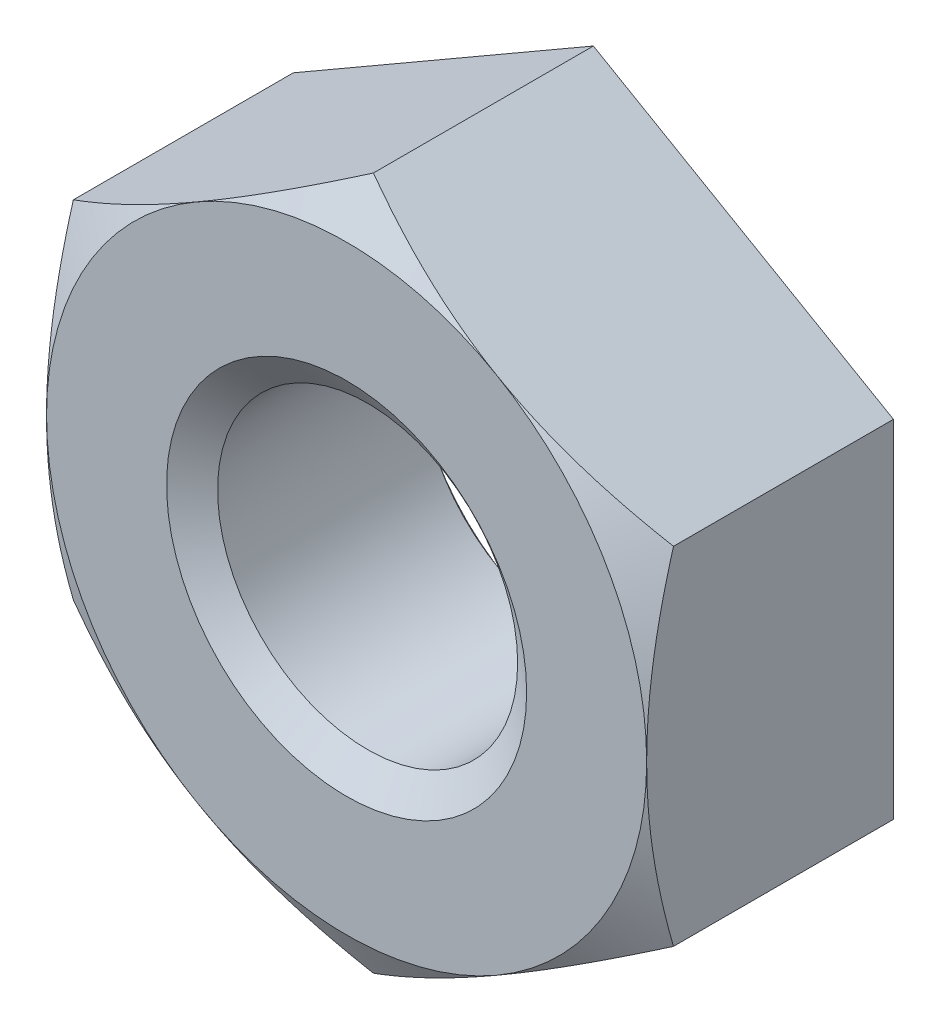
ISO-10303-21;
HEADER;
FILE_DESCRIPTION(('STEP AP214'),'2;1');
FILE_NAME('part.step','',(''),(''),'','','');
FILE_SCHEMA(('AUTOMOTIVE_DESIGN { 1 0 10303 214 1 1 1 1 }'));
ENDSEC;
DATA;
#1=APPLICATION_CONTEXT('core data for automotive mechanical design processes');
#2=APPLICATION_PROTOCOL_DEFINITION('international standard','automotive_design',2000,#1);
#3=PRODUCT_CONTEXT('',#1,'mechanical');
#4=PRODUCT('Part','Part','',(#3));
#5=PRODUCT_RELATED_PRODUCT_CATEGORY('part','',(#4));
#6=PRODUCT_DEFINITION_FORMATION('','',#4);
#7=PRODUCT_DEFINITION_CONTEXT('part definition',#1,'design');
#8=PRODUCT_DEFINITION('design','',#6,#7);
#9=PRODUCT_DEFINITION_SHAPE('','',#8);
#10=(LENGTH_UNIT() NAMED_UNIT(*) SI_UNIT(.MILLI.,.METRE.));
#11=(NAMED_UNIT(*) PLANE_ANGLE_UNIT() SI_UNIT($,.RADIAN.));
#12=(NAMED_UNIT(*) SI_UNIT($,.STERADIAN.) SOLID_ANGLE_UNIT());
#13=UNCERTAINTY_MEASURE_WITH_UNIT(LENGTH_MEASURE(1.E-05),#10,'distance_accuracy_value','');
#14=(GEOMETRIC_REPRESENTATION_CONTEXT(3) GLOBAL_UNCERTAINTY_ASSIGNED_CONTEXT((#13)) GLOBAL_UNIT_ASSIGNED_CONTEXT((#10,
#11,#12)) REPRESENTATION_CONTEXT('',''));
#15=CARTESIAN_POINT('',(0.,0.,0.));
#16=DIRECTION('',(0.,0.,1.));
#17=DIRECTION('',(1.,0.,0.));
#18=AXIS2_PLACEMENT_3D('',#15,#16,#17);
#19=CARTESIAN_POINT('',(0.,0.,-6.5278));
#20=DIRECTION('',(0.,0.,1.));
#21=DIRECTION('',(1.,0.,0.));
#22=AXIS2_PLACEMENT_3D('',#19,#20,#21);
#23=CYLINDRICAL_SURFACE('',#22,3.96875);
#24=CARTESIAN_POINT('',(0.,0.,-0.555789733453956));
#25=DIRECTION('',(0.,0.,1.));
#26=DIRECTION('',(1.,0.,0.));
#27=AXIS2_PLACEMENT_3D('',#24,#25,#26);
#28=CIRCLE('',#27,3.96875);
#29=CARTESIAN_POINT('',(3.96875,0.,-0.555789733453956));
#30=VERTEX_POINT('',#29);
#31=EDGE_CURVE('E131',#30,#30,#28,.F.);
#32=CARTESIAN_POINT('',(0.,0.,-5.94661026654604));
#33=DIRECTION('',(0.,0.,-1.));
#34=DIRECTION('',(-1.,0.,0.));
#35=AXIS2_PLACEMENT_3D('',#32,#33,#34);
#36=CIRCLE('',#35,3.96875);
#37=CARTESIAN_POINT('',(3.96875,0.,-5.94661026654604));
#38=VERTEX_POINT('',#37);
#39=EDGE_CURVE('E37',#38,#38,#36,.F.);
#40=CARTESIAN_POINT('',(3.96875,0.,-0.555789733453956));
#41=CARTESIAN_POINT('',(3.96875,0.,-0.611944114006998));
#42=CARTESIAN_POINT('',(3.96875,0.,-0.668098494560041));
#43=CARTESIAN_POINT('',(3.96875,0.,-0.780407255666126));
#44=CARTESIAN_POINT('',(3.96875,0.,-0.836561636219169));
#45=CARTESIAN_POINT('',(3.96875,0.,-0.948870397325254));
#46=CARTESIAN_POINT('',(3.96875,0.,-1.0050247778783));
#47=CARTESIAN_POINT('',(3.96875,0.,-1.11733353898438));
#48=CARTESIAN_POINT('',(3.96875,0.,-1.17348791953742));
#49=CARTESIAN_POINT('',(3.96875,0.,-1.28579668064351));
#50=CARTESIAN_POINT('',(3.96875,0.,-1.34195106119655));
#51=CARTESIAN_POINT('',(3.96875,0.,-1.45425982230264));
#52=CARTESIAN_POINT('',(3.96875,0.,-1.51041420285568));
#53=CARTESIAN_POINT('',(3.96875,0.,-1.62272296396176));
#54=CARTESIAN_POINT('',(3.96875,0.,-1.67887734451481));
#55=CARTESIAN_POINT('',(3.96875,0.,-1.79118610562089));
#56=CARTESIAN_POINT('',(3.96875,0.,-1.84734048617393));
#57=CARTESIAN_POINT('',(3.96875,0.,-1.95964924728002));
#58=CARTESIAN_POINT('',(3.96875,0.,-2.01580362783306));
#59=CARTESIAN_POINT('',(3.96875,0.,-2.12811238893915));
#60=CARTESIAN_POINT('',(3.96875,0.,-2.18426676949219));
#61=CARTESIAN_POINT('',(3.96875,0.,-2.29657553059828));
#62=CARTESIAN_POINT('',(3.96875,0.,-2.35272991115132));
#63=CARTESIAN_POINT('',(3.96875,0.,-2.4650386722574));
#64=CARTESIAN_POINT('',(3.96875,0.,-2.52119305281045));
#65=CARTESIAN_POINT('',(3.96875,0.,-2.63350181391653));
#66=CARTESIAN_POINT('',(3.96875,0.,-2.68965619446957));
#67=CARTESIAN_POINT('',(3.96875,0.,-2.80196495557566));
#68=CARTESIAN_POINT('',(3.96875,0.,-2.8581193361287));
#69=CARTESIAN_POINT('',(3.96875,0.,-2.97042809723479));
#70=CARTESIAN_POINT('',(3.96875,0.,-3.02658247778783));
#71=CARTESIAN_POINT('',(3.96875,0.,-3.13889123889391));
#72=CARTESIAN_POINT('',(3.96875,0.,-3.19504561944696));
#73=CARTESIAN_POINT('',(3.96875,0.,-3.30735438055304));
#74=CARTESIAN_POINT('',(3.96875,0.,-3.36350876110608));
#75=CARTESIAN_POINT('',(3.96875,0.,-3.47581752221217));
#76=CARTESIAN_POINT('',(3.96875,0.,-3.53197190276521));
#77=CARTESIAN_POINT('',(3.96875,0.,-3.6442806638713));
#78=CARTESIAN_POINT('',(3.96875,0.,-3.70043504442434));
#79=CARTESIAN_POINT('',(3.96875,0.,-3.81274380553042));
#80=CARTESIAN_POINT('',(3.96875,0.,-3.86889818608347));
#81=CARTESIAN_POINT('',(3.96875,0.,-3.98120694718955));
#82=CARTESIAN_POINT('',(3.96875,0.,-4.03736132774259));
#83=CARTESIAN_POINT('',(3.96875,0.,-4.14967008884868));
#84=CARTESIAN_POINT('',(3.96875,0.,-4.20582446940172));
#85=CARTESIAN_POINT('',(3.96875,0.,-4.31813323050781));
#86=CARTESIAN_POINT('',(3.96875,0.,-4.37428761106085));
#87=CARTESIAN_POINT('',(3.96875,0.,-4.48659637216693));
#88=CARTESIAN_POINT('',(3.96875,0.,-4.54275075271998));
#89=CARTESIAN_POINT('',(3.96875,0.,-4.65505951382606));
#90=CARTESIAN_POINT('',(3.96875,0.,-4.7112138943791));
#91=CARTESIAN_POINT('',(3.96875,0.,-4.82352265548519));
#92=CARTESIAN_POINT('',(3.96875,0.,-4.87967703603823));
#93=CARTESIAN_POINT('',(3.96875,0.,-4.99198579714432));
#94=CARTESIAN_POINT('',(3.96875,0.,-5.04814017769736));
#95=CARTESIAN_POINT('',(3.96875,0.,-5.16044893880344));
#96=CARTESIAN_POINT('',(3.96875,0.,-5.21660331935649));
#97=CARTESIAN_POINT('',(3.96875,0.,-5.32891208046257));
#98=CARTESIAN_POINT('',(3.96875,0.,-5.38506646101562));
#99=CARTESIAN_POINT('',(3.96875,0.,-5.4973752221217));
#100=CARTESIAN_POINT('',(3.96875,0.,-5.55352960267474));
#101=CARTESIAN_POINT('',(3.96875,0.,-5.66583836378083));
#102=CARTESIAN_POINT('',(3.96875,0.,-5.72199274433387));
#103=CARTESIAN_POINT('',(3.96875,0.,-5.83430150543996));
#104=CARTESIAN_POINT('',(3.96875,0.,-5.890455885993));
#105=CARTESIAN_POINT('',(3.96875,0.,-5.94661026654604));
#106=B_SPLINE_CURVE_WITH_KNOTS('',3,(#40,#41,#42,#43,#44,#45,#46,#47,#48,#49,#50,#51,#52,#53,
#54,#55,#56,#57,#58,#59,#60,#61,#62,#63,#64,#65,#66,#67,#68,#69,#70,#71,#72,#73,#74,#75,#76,#77,
#78,#79,#80,#81,#82,#83,#84,#85,#86,#87,#88,#89,#90,#91,#92,#93,#94,#95,#96,#97,#98,#99,#100,
#101,#102,#103,#104,#105),.UNSPECIFIED.,.F.,.F.,(4,2,2,2,2,2,2,2,2,2,2,2,2,2,2,2,2,2,2,2,2,2,2,
2,2,2,2,2,2,2,2,2,4),(0.,0.168463141659128,0.336926283318256,0.505389424977383,
0.673852566636511,0.842315708295639,1.01077884995477,1.17924199161389,1.34770513327302,
1.51616827493215,1.68463141659128,1.8530945582504,2.02155769990953,2.19002084156866,
2.35848398322779,2.52694712488691,2.69541026654604,2.86387340820517,3.0323365498643,
3.20079969152343,3.36926283318255,3.53772597484168,3.70618911650081,3.87465225815994,
4.04311539981906,4.21157854147819,4.38004168313732,4.54850482479645,4.71696796645557,
4.8854311081147,5.05389424977383,5.22235739143296,5.39082053309209),.UNSPECIFIED.);
#107=EDGE_CURVE('BSEAM32',#30,#38,#106,.T.);
#108=ORIENTED_EDGE('',*,*,#31,.F.);
#109=ORIENTED_EDGE('',*,*,#39,.F.);
#110=ORIENTED_EDGE('',*,*,#107,.T.);
#111=ORIENTED_EDGE('',*,*,#107,.F.);
#112=EDGE_LOOP('',(#108,#110,#109,#111));
#113=FACE_BOUND('',#112,.T.);
#114=ADVANCED_FACE('F32',(#113),#23,.F.);
#115=CARTESIAN_POINT('',(0.,9.16543552338532,-6.5278));
#116=DIRECTION('',(-0.499999999999983,0.866025403784448,0.));
#117=DIRECTION('',(-0.866025403784448,-0.499999999999983,0.));
#118=AXIS2_PLACEMENT_3D('',#115,#116,#117);
#119=PLANE('',#118);
#120=DIRECTION('',(0.,0.,1.));
#121=VECTOR('',#120,1.);
#122=CARTESIAN_POINT('',(-7.9375,4.58271776169282,-6.5278));
#123=LINE('',#122,#121);
#124=CARTESIAN_POINT('',(-7.9375,4.58271776169282,-6.5278));
#125=VERTEX_POINT('',#124);
#126=CARTESIAN_POINT('',(-7.9375,4.58271776169282,-0.708948904974025));
#127=VERTEX_POINT('',#126);
#128=EDGE_CURVE('E228',#125,#127,#123,.T.);
#129=ORIENTED_EDGE('',*,*,#128,.T.);
#130=CARTESIAN_POINT('',(-7.9377,4.58260229163898,-0.709015572900557));
#131=CARTESIAN_POINT('',(-7.76322502158793,4.68333546739203,-0.650866285897806));
#132=CARTESIAN_POINT('',(-7.58809953864738,4.78444421210972,-0.595356039210498));
#133=CARTESIAN_POINT('',(-7.23642632358312,4.98748283749384,-0.490340491808437));
#134=CARTESIAN_POINT('',(-7.05987801235101,5.08941305250867,-0.440837783112786));
#135=CARTESIAN_POINT('',(-6.52740632749454,5.39683572309639,-0.302312723142144));
#136=CARTESIAN_POINT('',(-6.16938105017105,5.60354171333579,-0.223521451359169));
#137=CARTESIAN_POINT('',(-5.63360314162946,5.91287323305812,-0.131129350120179));
#138=CARTESIAN_POINT('',(-5.45745113218669,6.01457464312819,-0.104809503727463));
#139=CARTESIAN_POINT('',(-5.10435050058562,6.21843738783409,-0.0606755611211758));
#140=CARTESIAN_POINT('',(-4.92740195020686,6.32059868102797,-0.0428607133854928));
#141=CARTESIAN_POINT('',(-4.57320017052289,6.52509717387595,-0.0161882579708191));
#142=CARTESIAN_POINT('',(-4.39594751669924,6.62743404127561,-0.00732048505628344));
#143=CARTESIAN_POINT('',(-4.04127846358514,6.83220231456425,0.00126770549344311));
#144=CARTESIAN_POINT('',(-3.86386206952283,6.93463371743477,0.000988405729545646));
#145=CARTESIAN_POINT('',(-3.53217533850321,7.12613314087557,-0.00808134398121513));
#146=CARTESIAN_POINT('',(-3.37788159577035,7.21521467477666,-0.0157654088390288));
#147=CARTESIAN_POINT('',(-3.06965548223459,7.39316910439779,-0.0379026215782627));
#148=CARTESIAN_POINT('',(-2.91572313649499,7.48204198564754,-0.0523562257657692));
#149=CARTESIAN_POINT('',(-2.45452203220573,7.74831656735948,-0.105529699236207));
#150=CARTESIAN_POINT('',(-2.14806963971136,7.92524693865991,-0.154055589218118));
#151=CARTESIAN_POINT('',(-1.5319140460875,8.28098453650132,-0.275371211073317));
#152=CARTESIAN_POINT('',(-1.22228948290784,8.4597463614008,-0.348675201689165));
#153=CARTESIAN_POINT('',(-0.607657694775784,8.81460418973134,-0.51504499141566));
#154=CARTESIAN_POINT('',(-0.302642598800529,8.99070473749954,-0.608071713945547));
#155=CARTESIAN_POINT('',(0.000200000000093927,9.16555099343916,-0.709015572900516));
#156=B_SPLINE_CURVE_WITH_KNOTS('',3,(#130,#131,#132,#133,#134,#135,#136,#137,#138,#139,#140,
#141,#142,#143,#144,#145,#146,#147,#148,#149,#150,#151,#152,#153,#154,#155),.UNSPECIFIED.,.F.,
.F.,(4,2,2,2,2,2,2,2,2,2,2,2,4),(0.,0.629020687135161,1.25831181455686,2.51950872534228,
3.13466137542382,3.74975965907415,4.36415830804195,4.97853797504025,5.5133907473673,
6.04827957705293,7.11881916910901,8.21310135188793,9.30523536686631),.UNSPECIFIED.);
#157=CARTESIAN_POINT('',(-3.96874999999987,6.87407664253906,0.));
#158=VERTEX_POINT('',#157);
#159=EDGE_CURVE('E117',#127,#158,#156,.T.);
#160=ORIENTED_EDGE('',*,*,#159,.T.);
#161=CARTESIAN_POINT('',(0.,9.16543552338532,-0.708948904974024));
#162=VERTEX_POINT('',#161);
#163=EDGE_CURVE('E143',#158,#162,#156,.T.);
#164=ORIENTED_EDGE('',*,*,#163,.T.);
#165=DIRECTION('',(0.,0.,1.));
#166=VECTOR('',#165,1.);
#167=CARTESIAN_POINT('',(0.,9.16543552338532,-6.5278));
#168=LINE('',#167,#166);
#169=CARTESIAN_POINT('',(0.,9.16543552338532,-6.5278));
#170=VERTEX_POINT('',#169);
#171=EDGE_CURVE('E240',#170,#162,#168,.T.);
#172=ORIENTED_EDGE('',*,*,#171,.F.);
#173=DIRECTION('',(-0.866025403784448,-0.499999999999983,0.));
#174=VECTOR('',#173,1.);
#175=CARTESIAN_POINT('',(0.,9.16543552338532,-6.5278));
#176=LINE('',#175,#174);
#177=EDGE_CURVE('E256',#170,#125,#176,.T.);
#178=ORIENTED_EDGE('',*,*,#177,.T.);
#179=EDGE_LOOP('',(#129,#160,#164,#172,#178));
#180=FACE_BOUND('',#179,.T.);
#181=ADVANCED_FACE('F34',(#180),#119,.T.);
#182=CARTESIAN_POINT('',(7.9375,4.58271776169249,-6.5278));
#183=DIRECTION('',(0.500000000000019,0.866025403784428,0.));
#184=DIRECTION('',(-0.866025403784428,0.500000000000019,0.));
#185=AXIS2_PLACEMENT_3D('',#182,#183,#184);
#186=PLANE('',#185);
#187=ORIENTED_EDGE('',*,*,#171,.T.);
#188=CARTESIAN_POINT('',(-0.000199999999906354,9.16555099343916,-0.709015572900516));
#189=CARTESIAN_POINT('',(0.174274978412156,9.06481781768609,-0.650866285897766));
#190=CARTESIAN_POINT('',(0.349400461352702,8.9637090729684,-0.595356039210459));
#191=CARTESIAN_POINT('',(0.701073676416951,8.76067044758427,-0.490340491808397));
#192=CARTESIAN_POINT('',(0.877621987649049,8.65874023256944,-0.440837783112746));
#193=CARTESIAN_POINT('',(1.41009367250551,8.35131756198169,-0.302312723142102));
#194=CARTESIAN_POINT('',(1.76811894982899,8.14461157174228,-0.223521451359127));
#195=CARTESIAN_POINT('',(2.30389685837056,7.83528005201993,-0.131129350120134));
#196=CARTESIAN_POINT('',(2.48004886781333,7.73357864194985,-0.104809503727416));
#197=CARTESIAN_POINT('',(2.83314949941439,7.52971589724394,-0.0606755611211275));
#198=CARTESIAN_POINT('',(3.01009804979314,7.42755460405005,-0.0428607133854442));
#199=CARTESIAN_POINT('',(3.3642998294771,7.22305611120206,-0.0161882579707695));
#200=CARTESIAN_POINT('',(3.54155248330074,7.1207192438024,-0.00732048505623324));
#201=CARTESIAN_POINT('',(3.89622153641483,6.91595097051374,0.00126770549349557));
#202=CARTESIAN_POINT('',(4.07363793047713,6.81351956764322,0.000988405729599707));
#203=CARTESIAN_POINT('',(4.40532466149675,6.6220201442024,-0.00808134398115898));
#204=CARTESIAN_POINT('',(4.55961840422961,6.53293861030131,-0.0157654088389722));
#205=CARTESIAN_POINT('',(4.86784451776536,6.35498418068016,-0.0379026215782056));
#206=CARTESIAN_POINT('',(5.02177686350495,6.26611129943041,-0.0523562257657121));
#207=CARTESIAN_POINT('',(5.48297796779421,5.99983671771844,-0.105529699236149));
#208=CARTESIAN_POINT('',(5.78943036028858,5.822906346418,-0.154055589218058));
#209=CARTESIAN_POINT('',(6.40558595391242,5.46716874857657,-0.275371211073258));
#210=CARTESIAN_POINT('',(6.71521051709208,5.28840692367706,-0.348675201689106));
#211=CARTESIAN_POINT('',(7.32984230522413,4.9335490953465,-0.515044991415604));
#212=CARTESIAN_POINT('',(7.63485740119938,4.75744854757828,-0.608071713945493));
#213=CARTESIAN_POINT('',(7.9377,4.58260229163865,-0.709015572900463));
#214=B_SPLINE_CURVE_WITH_KNOTS('',3,(#188,#189,#190,#191,#192,#193,#194,#195,#196,#197,#198,
#199,#200,#201,#202,#203,#204,#205,#206,#207,#208,#209,#210,#211,#212,#213),.UNSPECIFIED.,.F.,
.F.,(4,2,2,2,2,2,2,2,2,2,2,2,4),(0.,0.629020687135155,1.25831181455685,2.51950872534226,
3.1346613754238,3.74975965907412,4.36415830804191,4.97853797504022,5.51339074736726,
6.0482795770529,7.11881916910899,8.21310135188792,9.30523536686631),.UNSPECIFIED.);
#215=CARTESIAN_POINT('',(3.96875000000015,6.8740766425389,0.));
#216=VERTEX_POINT('',#215);
#217=EDGE_CURVE('E139',#162,#216,#214,.T.);
#218=ORIENTED_EDGE('',*,*,#217,.T.);
#219=CARTESIAN_POINT('',(7.9375,4.58271776169268,-0.708948904974024));
#220=VERTEX_POINT('',#219);
#221=EDGE_CURVE('E126',#216,#220,#214,.T.);
#222=ORIENTED_EDGE('',*,*,#221,.T.);
#223=DIRECTION('',(0.,0.,1.));
#224=VECTOR('',#223,1.);
#225=CARTESIAN_POINT('',(7.9375,4.58271776169249,-6.5278));
#226=LINE('',#225,#224);
#227=CARTESIAN_POINT('',(7.9375,4.58271776169249,-6.5278));
#228=VERTEX_POINT('',#227);
#229=EDGE_CURVE('E138',#228,#220,#226,.T.);
#230=ORIENTED_EDGE('',*,*,#229,.F.);
#231=DIRECTION('',(-0.866025403784428,0.500000000000019,0.));
#232=VECTOR('',#231,1.);
#233=CARTESIAN_POINT('',(7.9375,4.58271776169249,-6.5278));
#234=LINE('',#233,#232);
#235=EDGE_CURVE('E232',#228,#170,#234,.T.);
#236=ORIENTED_EDGE('',*,*,#235,.T.);
#237=EDGE_LOOP('',(#187,#218,#222,#230,#236));
#238=FACE_BOUND('',#237,.T.);
#239=ADVANCED_FACE('F208',(#238),#186,.T.);
#240=CARTESIAN_POINT('',(7.9375,4.58271776169249,-6.5278));
#241=DIRECTION('',(-1.,0.,0.));
#242=DIRECTION('',(0.,0.,1.));
#243=AXIS2_PLACEMENT_3D('',#240,#241,#242);
#244=PLANE('',#243);
#245=CARTESIAN_POINT('',(7.9375,-12.1540428550748,-3.79830572339944));
#246=CARTESIAN_POINT('',(7.9375,-11.8055417137513,-3.62989072544695));
#247=CARTESIAN_POINT('',(7.9375,-11.4562166090856,-3.46314991100229));
#248=CARTESIAN_POINT('',(7.9375,-10.7554729351183,-3.13397333785365));
#249=CARTESIAN_POINT('',(7.9375,-10.4040540160887,-2.97153832452219));
#250=CARTESIAN_POINT('',(7.9375,-9.69677883875674,-2.65107432577963));
#251=CARTESIAN_POINT('',(7.9375,-9.34090869565809,-2.49307587372601));
#252=CARTESIAN_POINT('',(7.9375,-8.62624353744284,-2.18386537817083));
#253=CARTESIAN_POINT('',(7.9375,-8.26744867594113,-2.03265298092497));
#254=CARTESIAN_POINT('',(7.9375,-7.54190895000615,-1.73702395542256));
#255=CARTESIAN_POINT('',(7.9375,-7.17512056255616,-1.59271354918174));
#256=CARTESIAN_POINT('',(7.9375,-6.43721845801451,-1.31539498874067));
#257=CARTESIAN_POINT('',(7.9375,-6.066104264908,-1.18238809199672));
#258=CARTESIAN_POINT('',(7.9375,-5.31971777432218,-0.931250932769844));
#259=CARTESIAN_POINT('',(7.9375,-4.94445623605253,-0.813089042609656));
#260=CARTESIAN_POINT('',(7.9375,-4.18861180807505,-0.595477465323818));
#261=CARTESIAN_POINT('',(7.9375,-3.80803064222036,-0.496021860734109));
#262=CARTESIAN_POINT('',(7.9375,-3.0412234172515,-0.320658395772123));
#263=CARTESIAN_POINT('',(7.9375,-2.65499588371972,-0.244756805288625));
#264=CARTESIAN_POINT('',(7.9375,-2.07225592781309,-0.152370391651536));
#265=CARTESIAN_POINT('',(7.9375,-1.87741892555742,-0.125150577555812));
#266=CARTESIAN_POINT('',(7.9375,-1.48683143967858,-0.0784018471326018));
#267=CARTESIAN_POINT('',(7.9375,-1.29108104843307,-0.0588721694033842));
#268=CARTESIAN_POINT('',(7.9375,-0.900173147631192,-0.0280292816344308));
#269=CARTESIAN_POINT('',(7.9375,-0.705019680022336,-0.0166650499450555));
#270=CARTESIAN_POINT('',(7.9375,-0.314406625859884,-0.00221313706756388));
#271=CARTESIAN_POINT('',(7.9375,-0.118947043314611,0.000874651601976446));
#272=CARTESIAN_POINT('',(7.9375,0.271871450970486,-0.00129989647433457));
#273=CARTESIAN_POINT('',(7.9375,0.467230375568073,-0.00655988978079131));
#274=CARTESIAN_POINT('',(7.9375,0.857556246985908,-0.0252991998003059));
#275=CARTESIAN_POINT('',(7.9375,1.05252317374343,-0.0387789269758079));
#276=CARTESIAN_POINT('',(7.9375,1.52506297457954,-0.0811297065316129));
#277=CARTESIAN_POINT('',(7.9375,1.80227278881696,-0.114119139529962));
#278=CARTESIAN_POINT('',(7.9375,2.35456818411291,-0.194883786983908));
#279=CARTESIAN_POINT('',(7.9375,2.62965316433381,-0.242663037198066));
#280=CARTESIAN_POINT('',(7.9375,3.17747194953975,-0.351312741869483));
#281=CARTESIAN_POINT('',(7.9375,3.4502032761159,-0.412195574142739));
#282=CARTESIAN_POINT('',(7.9375,3.99285991142013,-0.545194835610296));
#283=CARTESIAN_POINT('',(7.9375,4.26278548193587,-0.617310206545773));
#284=CARTESIAN_POINT('',(7.9375,4.80647881225565,-0.772934354165224));
#285=CARTESIAN_POINT('',(7.9375,5.08017856871108,-0.856679077611889));
#286=CARTESIAN_POINT('',(7.9375,5.62468506827777,-1.03244298730137));
#287=CARTESIAN_POINT('',(7.9375,5.89549366465436,-1.12445646631555));
#288=CARTESIAN_POINT('',(7.9375,6.43313118794731,-1.31485725841808));
#289=CARTESIAN_POINT('',(7.9375,6.69997393537356,-1.4132057801201));
#290=CARTESIAN_POINT('',(7.9375,7.23158910056609,-1.61567532168825));
#291=CARTESIAN_POINT('',(7.9375,7.49636063153354,-1.71979867460119));
#292=CARTESIAN_POINT('',(7.9375,7.76017027676663,-1.82623818485622));
#293=B_SPLINE_CURVE_WITH_KNOTS('',3,(#245,#246,#247,#248,#249,#250,#251,#252,#253,#254,#255,
#256,#257,#258,#259,#260,#261,#262,#263,#264,#265,#266,#267,#268,#269,#270,#271,#272,#273,#274,
#275,#276,#277,#278,#279,#280,#281,#282,#283,#284,#285,#286,#287,#288,#289,#290,#291,#292),
.UNSPECIFIED.,.F.,.F.,(4,2,2,2,2,2,2,2,2,2,2,2,2,2,2,2,2,2,2,2,2,2,2,4),(0.,1.16120027580623,
2.3226002700954,3.4906464875063,4.65863174596448,5.84095623854381,7.02341208683705,
8.20330434634276,9.38282273386193,10.5626548308775,11.1527144520002,11.7427156365191,
12.3289973680831,12.9152714859051,13.501381050453,14.0875198854945,14.9245510617841,
15.7618108438773,16.5998650111811,17.4378402700213,18.2963561134772,19.1542838811018,
20.007382654881,20.8608286295793),.UNSPECIFIED.);
#294=CARTESIAN_POINT('',(7.93749999999988,-4.58271776169289,-0.708948904974024));
#295=VERTEX_POINT('',#294);
#296=CARTESIAN_POINT('',(7.9375,0.,0.));
#297=VERTEX_POINT('',#296);
#298=EDGE_CURVE('E106',#295,#297,#293,.T.);
#299=ORIENTED_EDGE('',*,*,#298,.F.);
#300=DIRECTION('',(0.,0.,1.));
#301=VECTOR('',#300,1.);
#302=CARTESIAN_POINT('',(7.9375,-4.58271776169282,-6.5278));
#303=LINE('',#302,#301);
#304=CARTESIAN_POINT('',(7.9375,-4.58271776169282,-6.5278));
#305=VERTEX_POINT('',#304);
#306=EDGE_CURVE('E237',#305,#295,#303,.T.);
#307=ORIENTED_EDGE('',*,*,#306,.F.);
#308=DIRECTION('',(0.,-1.,0.));
#309=VECTOR('',#308,1.);
#310=CARTESIAN_POINT('',(7.9375,4.58271776169249,-6.5278));
#311=LINE('',#310,#309);
#312=EDGE_CURVE('E245',#228,#305,#311,.T.);
#313=ORIENTED_EDGE('',*,*,#312,.F.);
#314=ORIENTED_EDGE('',*,*,#229,.T.);
#315=EDGE_CURVE('E119',#297,#220,#293,.T.);
#316=ORIENTED_EDGE('',*,*,#315,.F.);
#317=EDGE_LOOP('',(#299,#307,#313,#314,#316));
#318=FACE_BOUND('',#317,.T.);
#319=ADVANCED_FACE('F136',(#318),#244,.F.);
#320=CARTESIAN_POINT('',(0.,-9.1654355233853,-6.5278));
#321=DIRECTION('',(0.499999999999982,-0.866025403784449,0.));
#322=DIRECTION('',(0.866025403784449,0.499999999999982,0.));
#323=AXIS2_PLACEMENT_3D('',#320,#321,#322);
#324=PLANE('',#323);
#325=ORIENTED_EDGE('',*,*,#306,.T.);
#326=CARTESIAN_POINT('',(7.9377,-4.58260229163898,-0.709015572900558));
#327=CARTESIAN_POINT('',(7.76322502158793,-4.68333546739203,-0.650866285897806));
#328=CARTESIAN_POINT('',(7.58809953864738,-4.78444421210972,-0.595356039210498));
#329=CARTESIAN_POINT('',(7.23642632358312,-4.98748283749384,-0.490340491808437));
#330=CARTESIAN_POINT('',(7.05987801235102,-5.08941305250867,-0.440837783112787));
#331=CARTESIAN_POINT('',(6.52740632749454,-5.39683572309639,-0.302312723142145));
#332=CARTESIAN_POINT('',(6.16938105017104,-5.60354171333579,-0.223521451359169));
#333=CARTESIAN_POINT('',(5.63360314162946,-5.91287323305811,-0.131129350120178));
#334=CARTESIAN_POINT('',(5.45745113218669,-6.01457464312819,-0.10480950372746));
#335=CARTESIAN_POINT('',(5.10435050058562,-6.21843738783408,-0.0606755611211728));
#336=CARTESIAN_POINT('',(4.92740195020686,-6.32059868102797,-0.0428607133854892));
#337=CARTESIAN_POINT('',(4.57320017052289,-6.52509717387594,-0.0161882579708156));
#338=CARTESIAN_POINT('',(4.39594751669924,-6.6274340412756,-0.00732048505628067));
#339=CARTESIAN_POINT('',(4.04127846358514,-6.83220231456424,0.00126770549344684));
#340=CARTESIAN_POINT('',(3.86386206952283,-6.93463371743476,0.000988405729551028));
#341=CARTESIAN_POINT('',(3.5321753385032,-7.12613314087556,-0.00808134398120855));
#342=CARTESIAN_POINT('',(3.37788159577034,-7.21521467477665,-0.0157654088390224));
#343=CARTESIAN_POINT('',(3.06965548223459,-7.39316910439778,-0.0379026215782568));
#344=CARTESIAN_POINT('',(2.91572313649499,-7.48204198564752,-0.0523562257657636));
#345=CARTESIAN_POINT('',(2.45452203220573,-7.74831656735947,-0.105529699236201));
#346=CARTESIAN_POINT('',(2.14806963971136,-7.92524693865989,-0.15405558921811));
#347=CARTESIAN_POINT('',(1.5319140460875,-8.2809845365013,-0.275371211073308));
#348=CARTESIAN_POINT('',(1.22228948290784,-8.45974636140079,-0.348675201689155));
#349=CARTESIAN_POINT('',(0.607657694775785,-8.81460418973132,-0.51504499141565));
#350=CARTESIAN_POINT('',(0.302642598800529,-8.99070473749952,-0.608071713945536));
#351=CARTESIAN_POINT('',(-0.000200000000094431,-9.16555099343914,-0.709015572900505));
#352=B_SPLINE_CURVE_WITH_KNOTS('',3,(#326,#327,#328,#329,#330,#331,#332,#333,#334,#335,#336,
#337,#338,#339,#340,#341,#342,#343,#344,#345,#346,#347,#348,#349,#350,#351),.UNSPECIFIED.,.F.,
.F.,(4,2,2,2,2,2,2,2,2,2,2,2,4),(0.,0.62902068713516,1.25831181455686,2.51950872534228,
3.13466137542383,3.74975965907415,4.36415830804195,4.97853797504025,5.51339074736729,
6.04827957705292,7.11881916910901,8.21310135188792,9.3052353668663),.UNSPECIFIED.);
#353=CARTESIAN_POINT('',(3.96874999999985,-6.87407664253907,0.));
#354=VERTEX_POINT('',#353);
#355=EDGE_CURVE('E112',#295,#354,#352,.T.);
#356=ORIENTED_EDGE('',*,*,#355,.T.);
#357=CARTESIAN_POINT('',(0.,-9.16543552338532,-0.708948904974024));
#358=VERTEX_POINT('',#357);
#359=EDGE_CURVE('E51',#354,#358,#352,.T.);
#360=ORIENTED_EDGE('',*,*,#359,.T.);
#361=DIRECTION('',(0.,0.,1.));
#362=VECTOR('',#361,1.);
#363=CARTESIAN_POINT('',(0.,-9.1654355233853,-6.5278));
#364=LINE('',#363,#362);
#365=CARTESIAN_POINT('',(0.,-9.1654355233853,-6.5278));
#366=VERTEX_POINT('',#365);
#367=EDGE_CURVE('E234',#366,#358,#364,.T.);
#368=ORIENTED_EDGE('',*,*,#367,.F.);
#369=DIRECTION('',(0.866025403784449,0.499999999999982,0.));
#370=VECTOR('',#369,1.);
#371=CARTESIAN_POINT('',(0.,-9.1654355233853,-6.5278));
#372=LINE('',#371,#370);
#373=EDGE_CURVE('E247',#366,#305,#372,.T.);
#374=ORIENTED_EDGE('',*,*,#373,.T.);
#375=EDGE_LOOP('',(#325,#356,#360,#368,#374));
#376=FACE_BOUND('',#375,.T.);
#377=ADVANCED_FACE('F190',(#376),#324,.T.);
#378=CARTESIAN_POINT('',(-7.9375,-4.58271776169249,-6.5278));
#379=DIRECTION('',(-0.500000000000017,-0.866025403784429,0.));
#380=DIRECTION('',(0.866025403784429,-0.500000000000017,0.));
#381=AXIS2_PLACEMENT_3D('',#378,#379,#380);
#382=PLANE('',#381);
#383=ORIENTED_EDGE('',*,*,#367,.T.);
#384=CARTESIAN_POINT('',(0.000199999999906325,-9.16555099343914,-0.709015572900505));
#385=CARTESIAN_POINT('',(-0.174274978412156,-9.06481781768607,-0.650866285897755));
#386=CARTESIAN_POINT('',(-0.349400461352702,-8.96370907296838,-0.595356039210447));
#387=CARTESIAN_POINT('',(-0.701073676416952,-8.76067044758425,-0.490340491808387));
#388=CARTESIAN_POINT('',(-0.87762198764905,-8.65874023256942,-0.440837783112736));
#389=CARTESIAN_POINT('',(-1.41009367250551,-8.35131756198168,-0.302312723142094));
#390=CARTESIAN_POINT('',(-1.76811894982899,-8.14461157174226,-0.223521451359119));
#391=CARTESIAN_POINT('',(-2.30389685837056,-7.83528005201992,-0.131129350120127));
#392=CARTESIAN_POINT('',(-2.48004886781333,-7.73357864194984,-0.10480950372741));
#393=CARTESIAN_POINT('',(-2.83314949941438,-7.52971589724393,-0.0606755611211221));
#394=CARTESIAN_POINT('',(-3.01009804979313,-7.42755460405004,-0.0428607133854383));
#395=CARTESIAN_POINT('',(-3.36429982947709,-7.22305611120205,-0.0161882579707634));
#396=CARTESIAN_POINT('',(-3.54155248330074,-7.12071924380239,-0.00732048505622729));
#397=CARTESIAN_POINT('',(-3.89622153641483,-6.91595097051374,0.00126770549350063));
#398=CARTESIAN_POINT('',(-4.07363793047713,-6.81351956764321,0.000988405729604086));
#399=CARTESIAN_POINT('',(-4.40532466149675,-6.6220201442024,-0.00808134398115554));
#400=CARTESIAN_POINT('',(-4.5596184042296,-6.5329386103013,-0.0157654088389691));
#401=CARTESIAN_POINT('',(-4.86784451776536,-6.35498418068015,-0.0379026215782025));
#402=CARTESIAN_POINT('',(-5.02177686350495,-6.26611129943041,-0.0523562257657086));
#403=CARTESIAN_POINT('',(-5.48297796779421,-5.99983671771844,-0.105529699236145));
#404=CARTESIAN_POINT('',(-5.78943036028858,-5.822906346418,-0.154055589218056));
#405=CARTESIAN_POINT('',(-6.40558595391242,-5.46716874857657,-0.275371211073257));
#406=CARTESIAN_POINT('',(-6.71521051709208,-5.28840692367706,-0.348675201689105));
#407=CARTESIAN_POINT('',(-7.32984230522413,-4.93354909534651,-0.515044991415604));
#408=CARTESIAN_POINT('',(-7.63485740119938,-4.75744854757829,-0.608071713945493));
#409=CARTESIAN_POINT('',(-7.9377,-4.58260229163866,-0.709015572900464));
#410=B_SPLINE_CURVE_WITH_KNOTS('',3,(#384,#385,#386,#387,#388,#389,#390,#391,#392,#393,#394,
#395,#396,#397,#398,#399,#400,#401,#402,#403,#404,#405,#406,#407,#408,#409),.UNSPECIFIED.,.F.,
.F.,(4,2,2,2,2,2,2,2,2,2,2,2,4),(0.,0.629020687135155,1.25831181455685,2.51950872534225,
3.1346613754238,3.74975965907412,4.36415830804191,4.97853797504021,5.51339074736725,
6.04827957705288,7.11881916910898,8.21310135188791,9.3052353668663),.UNSPECIFIED.);
#411=CARTESIAN_POINT('',(-3.96875000000013,-6.8740766425389,0.));
#412=VERTEX_POINT('',#411);
#413=EDGE_CURVE('E184',#358,#412,#410,.T.);
#414=ORIENTED_EDGE('',*,*,#413,.T.);
#415=CARTESIAN_POINT('',(-7.9375,-4.58271776169268,-0.708948904974024));
#416=VERTEX_POINT('',#415);
#417=EDGE_CURVE('E58',#412,#416,#410,.T.);
#418=ORIENTED_EDGE('',*,*,#417,.T.);
#419=DIRECTION('',(0.,0.,1.));
#420=VECTOR('',#419,1.);
#421=CARTESIAN_POINT('',(-7.9375,-4.58271776169249,-6.5278));
#422=LINE('',#421,#420);
#423=CARTESIAN_POINT('',(-7.9375,-4.58271776169249,-6.5278));
#424=VERTEX_POINT('',#423);
#425=EDGE_CURVE('E231',#424,#416,#422,.T.);
#426=ORIENTED_EDGE('',*,*,#425,.F.);
#427=DIRECTION('',(0.866025403784429,-0.500000000000017,0.));
#428=VECTOR('',#427,1.);
#429=CARTESIAN_POINT('',(-7.9375,-4.58271776169249,-6.5278));
#430=LINE('',#429,#428);
#431=EDGE_CURVE('E250',#424,#366,#430,.T.);
#432=ORIENTED_EDGE('',*,*,#431,.T.);
#433=EDGE_LOOP('',(#383,#414,#418,#426,#432));
#434=FACE_BOUND('',#433,.T.);
#435=ADVANCED_FACE('F186',(#434),#382,.T.);
#436=CARTESIAN_POINT('',(-7.9375,4.58271776169282,-6.5278));
#437=DIRECTION('',(-1.,0.,0.));
#438=DIRECTION('',(0.,-1.,0.));
#439=AXIS2_PLACEMENT_3D('',#436,#437,#438);
#440=PLANE('',#439);
#441=ORIENTED_EDGE('',*,*,#425,.T.);
#442=CARTESIAN_POINT('',(-7.93750000000001,-12.1540428550746,-3.79830572339936));
#443=CARTESIAN_POINT('',(-7.9375,-11.8055417137511,-3.62989072544688));
#444=CARTESIAN_POINT('',(-7.9375,-11.4562166090855,-3.46314991100222));
#445=CARTESIAN_POINT('',(-7.9375,-10.7554729351181,-3.13397333785358));
#446=CARTESIAN_POINT('',(-7.9375,-10.4040540160885,-2.97153832452213));
#447=CARTESIAN_POINT('',(-7.9375,-9.69677883875659,-2.65107432577956));
#448=CARTESIAN_POINT('',(-7.9375,-9.34090869565794,-2.49307587372594));
#449=CARTESIAN_POINT('',(-7.9375,-8.62624353744269,-2.18386537817077));
#450=CARTESIAN_POINT('',(-7.9375,-8.26744867594098,-2.03265298092491));
#451=CARTESIAN_POINT('',(-7.9375,-7.54190895000601,-1.7370239554225));
#452=CARTESIAN_POINT('',(-7.9375,-7.17512056255602,-1.59271354918169));
#453=CARTESIAN_POINT('',(-7.9375,-6.43721845801438,-1.31539498874063));
#454=CARTESIAN_POINT('',(-7.9375,-6.06610426490787,-1.18238809199668));
#455=CARTESIAN_POINT('',(-7.9375,-5.31971777432206,-0.931250932769806));
#456=CARTESIAN_POINT('',(-7.9375,-4.94445623605241,-0.813089042609621));
#457=CARTESIAN_POINT('',(-7.9375,-4.18861180807494,-0.595477465323789));
#458=CARTESIAN_POINT('',(-7.9375,-3.80803064222025,-0.496021860734083));
#459=CARTESIAN_POINT('',(-7.9375,-3.04122341725139,-0.320658395772102));
#460=CARTESIAN_POINT('',(-7.9375,-2.65499588371962,-0.244756805288607));
#461=CARTESIAN_POINT('',(-7.9375,-2.072255927813,-0.152370391651522));
#462=CARTESIAN_POINT('',(-7.9375,-1.87741892555732,-0.1251505775558));
#463=CARTESIAN_POINT('',(-7.9375,-1.48683143967849,-0.0784018471325929));
#464=CARTESIAN_POINT('',(-7.9375,-1.29108104843298,-0.0588721694033772));
#465=CARTESIAN_POINT('',(-7.9375,-0.900173147631108,-0.0280292816344263));
#466=CARTESIAN_POINT('',(-7.9375,-0.705019680022254,-0.0166650499450518));
#467=CARTESIAN_POINT('',(-7.9375,-0.314406625859805,-0.00221313706756185));
#468=CARTESIAN_POINT('',(-7.9375,-0.118947043314535,0.000874651601977491));
#469=CARTESIAN_POINT('',(-7.9375,0.271871450970559,-0.00129989647433558));
#470=CARTESIAN_POINT('',(-7.9375,0.467230375568144,-0.0065598897807934));
#471=CARTESIAN_POINT('',(-7.9375,0.857556246985975,-0.0252991998003095));
#472=CARTESIAN_POINT('',(-7.9375,1.0525231737435,-0.038778926975812));
#473=CARTESIAN_POINT('',(-7.9375,1.5250629745796,-0.0811297065316189));
#474=CARTESIAN_POINT('',(-7.9375,1.80227278881703,-0.11411913952997));
#475=CARTESIAN_POINT('',(-7.9375,2.35456818411298,-0.194883786983919));
#476=CARTESIAN_POINT('',(-7.9375,2.62965316433389,-0.242663037198079));
#477=CARTESIAN_POINT('',(-7.9375,3.17747194953982,-0.351312741869499));
#478=CARTESIAN_POINT('',(-7.9375,3.45020327611597,-0.412195574142756));
#479=CARTESIAN_POINT('',(-7.9375,3.99285991142021,-0.545194835610316));
#480=CARTESIAN_POINT('',(-7.9375,4.26278548193595,-0.617310206545795));
#481=CARTESIAN_POINT('',(-7.9375,4.80647881225574,-0.772934354165248));
#482=CARTESIAN_POINT('',(-7.9375,5.08017856871116,-0.856679077611915));
#483=CARTESIAN_POINT('',(-7.9375,5.62468506827786,-1.0324429873014));
#484=CARTESIAN_POINT('',(-7.9375,5.89549366465445,-1.12445646631558));
#485=CARTESIAN_POINT('',(-7.9375,6.43313118794741,-1.31485725841811));
#486=CARTESIAN_POINT('',(-7.9375,6.69997393537366,-1.41320578012014));
#487=CARTESIAN_POINT('',(-7.9375,7.23158910056619,-1.61567532168829));
#488=CARTESIAN_POINT('',(-7.9375,7.49636063153364,-1.71979867460123));
#489=CARTESIAN_POINT('',(-7.9375,7.76017027676673,-1.82623818485627));
#490=B_SPLINE_CURVE_WITH_KNOTS('',3,(#442,#443,#444,#445,#446,#447,#448,#449,#450,#451,#452,
#453,#454,#455,#456,#457,#458,#459,#460,#461,#462,#463,#464,#465,#466,#467,#468,#469,#470,#471,
#472,#473,#474,#475,#476,#477,#478,#479,#480,#481,#482,#483,#484,#485,#486,#487,#488,#489),
.UNSPECIFIED.,.F.,.F.,(4,2,2,2,2,2,2,2,2,2,2,2,2,2,2,2,2,2,2,2,2,2,2,4),(0.,1.16120027580623,
2.32260027009538,3.49064648750628,4.65863174596446,5.84095623854377,7.023412086837,
8.2033043463427,9.38282273386185,10.5626548308774,11.1527144520001,11.742715636519,
12.328997368083,12.915271485905,13.5013810504529,14.0875198854944,14.924551061784,
15.7618108438772,16.599865011181,17.4378402700213,18.2963561134771,19.1542838811018,
20.0073826548809,20.8608286295792),.UNSPECIFIED.);
#491=CARTESIAN_POINT('',(-7.9375,0.,0.));
#492=VERTEX_POINT('',#491);
#493=EDGE_CURVE('E185',#416,#492,#490,.T.);
#494=ORIENTED_EDGE('',*,*,#493,.T.);
#495=EDGE_CURVE('E130',#492,#127,#490,.T.);
#496=ORIENTED_EDGE('',*,*,#495,.T.);
#497=ORIENTED_EDGE('',*,*,#128,.F.);
#498=DIRECTION('',(0.,-1.,0.));
#499=VECTOR('',#498,1.);
#500=CARTESIAN_POINT('',(-7.9375,4.58271776169282,-6.5278));
#501=LINE('',#500,#499);
#502=EDGE_CURVE('E253',#125,#424,#501,.T.);
#503=ORIENTED_EDGE('',*,*,#502,.T.);
#504=EDGE_LOOP('',(#441,#494,#496,#497,#503));
#505=FACE_BOUND('',#504,.T.);
#506=ADVANCED_FACE('F189',(#505),#440,.T.);
#507=CARTESIAN_POINT('',(7.9375,13.7481532850777,0.));
#508=DIRECTION('',(0.,0.,1.));
#509=DIRECTION('',(1.,0.,0.));
#510=AXIS2_PLACEMENT_3D('',#507,#508,#509);
#511=PLANE('',#510);
#512=CARTESIAN_POINT('',(0.,0.,0.));
#513=DIRECTION('',(0.,0.,1.));
#514=DIRECTION('',(1.,0.,0.));
#515=AXIS2_PLACEMENT_3D('',#512,#513,#514);
#516=CIRCLE('',#515,4.7625);
#517=CARTESIAN_POINT('',(4.7625,0.,0.));
#518=VERTEX_POINT('',#517);
#519=EDGE_CURVE('E216',#518,#518,#516,.T.);
#520=ORIENTED_EDGE('',*,*,#519,.F.);
#521=EDGE_LOOP('',(#520));
#522=FACE_BOUND('',#521,.T.);
#523=CARTESIAN_POINT('',(0.,0.,0.));
#524=DIRECTION('',(0.,0.,1.));
#525=DIRECTION('',(1.,0.,0.));
#526=AXIS2_PLACEMENT_3D('',#523,#524,#525);
#527=CIRCLE('',#526,7.9375);
#528=EDGE_CURVE('E11',#297,#354,#527,.F.);
#529=ORIENTED_EDGE('',*,*,#528,.F.);
#530=CARTESIAN_POINT('',(0.,0.,0.));
#531=DIRECTION('',(0.,0.,1.));
#532=DIRECTION('',(1.,0.,0.));
#533=AXIS2_PLACEMENT_3D('',#530,#531,#532);
#534=CIRCLE('',#533,7.9375);
#535=EDGE_CURVE('E123',#297,#216,#534,.T.);
#536=ORIENTED_EDGE('',*,*,#535,.T.);
#537=EDGE_CURVE('E44',#158,#216,#527,.F.);
#538=ORIENTED_EDGE('',*,*,#537,.F.);
#539=EDGE_CURVE('E283',#492,#158,#527,.F.);
#540=ORIENTED_EDGE('',*,*,#539,.F.);
#541=EDGE_CURVE('E284',#412,#492,#527,.F.);
#542=ORIENTED_EDGE('',*,*,#541,.F.);
#543=EDGE_CURVE('E42',#354,#412,#527,.F.);
#544=ORIENTED_EDGE('',*,*,#543,.F.);
#545=EDGE_LOOP('',(#529,#536,#538,#540,#542,#544));
#546=FACE_BOUND('',#545,.T.);
#547=ADVANCED_FACE('F133',(#522,#546),#511,.T.);
#548=CARTESIAN_POINT('',(7.9375,13.7481532850777,-6.5278));
#549=DIRECTION('',(0.,0.,1.));
#550=DIRECTION('',(1.,0.,0.));
#551=AXIS2_PLACEMENT_3D('',#548,#549,#550);
#552=PLANE('',#551);
#553=CARTESIAN_POINT('',(0.,0.,-6.5278));
#554=DIRECTION('',(0.,0.,1.));
#555=DIRECTION('',(1.,0.,0.));
#556=AXIS2_PLACEMENT_3D('',#553,#554,#555);
#557=CIRCLE('',#556,4.7625);
#558=CARTESIAN_POINT('',(4.7625,0.,-6.5278));
#559=VERTEX_POINT('',#558);
#560=EDGE_CURVE('E217',#559,#559,#557,.F.);
#561=ORIENTED_EDGE('',*,*,#560,.F.);
#562=EDGE_LOOP('',(#561));
#563=FACE_BOUND('',#562,.T.);
#564=ORIENTED_EDGE('',*,*,#177,.F.);
#565=ORIENTED_EDGE('',*,*,#235,.F.);
#566=ORIENTED_EDGE('',*,*,#312,.T.);
#567=ORIENTED_EDGE('',*,*,#373,.F.);
#568=ORIENTED_EDGE('',*,*,#431,.F.);
#569=ORIENTED_EDGE('',*,*,#502,.F.);
#570=EDGE_LOOP('',(#564,#565,#566,#567,#568,#569));
#571=FACE_BOUND('',#570,.T.);
#572=ADVANCED_FACE('F199',(#563,#571),#552,.F.);
#573=CARTESIAN_POINT('',(0.,0.,0.));
#574=DIRECTION('',(0.,0.,-1.));
#575=DIRECTION('',(-1.,0.,0.));
#576=AXIS2_PLACEMENT_3D('',#573,#574,#575);
#577=CONICAL_SURFACE('',#576,7.9375,1.04719755119659);
#578=ORIENTED_EDGE('',*,*,#535,.F.);
#579=ORIENTED_EDGE('',*,*,#315,.T.);
#580=ORIENTED_EDGE('',*,*,#221,.F.);
#581=EDGE_LOOP('',(#578,#579,#580));
#582=FACE_BOUND('',#581,.T.);
#583=ADVANCED_FACE('F124',(#582),#577,.T.);
#584=ORIENTED_EDGE('',*,*,#537,.T.);
#585=ORIENTED_EDGE('',*,*,#217,.F.);
#586=ORIENTED_EDGE('',*,*,#163,.F.);
#587=EDGE_LOOP('',(#584,#585,#586));
#588=FACE_BOUND('',#587,.T.);
#589=ADVANCED_FACE('F167',(#588),#577,.T.);
#590=ORIENTED_EDGE('',*,*,#495,.F.);
#591=ORIENTED_EDGE('',*,*,#539,.T.);
#592=ORIENTED_EDGE('',*,*,#159,.F.);
#593=EDGE_LOOP('',(#590,#591,#592));
#594=FACE_BOUND('',#593,.T.);
#595=ADVANCED_FACE('F166',(#594),#577,.T.);
#596=ORIENTED_EDGE('',*,*,#541,.T.);
#597=ORIENTED_EDGE('',*,*,#493,.F.);
#598=ORIENTED_EDGE('',*,*,#417,.F.);
#599=EDGE_LOOP('',(#596,#597,#598));
#600=FACE_BOUND('',#599,.T.);
#601=ADVANCED_FACE('F160',(#600),#577,.T.);
#602=ORIENTED_EDGE('',*,*,#543,.T.);
#603=ORIENTED_EDGE('',*,*,#413,.F.);
#604=ORIENTED_EDGE('',*,*,#359,.F.);
#605=EDGE_LOOP('',(#602,#603,#604));
#606=FACE_BOUND('',#605,.T.);
#607=ADVANCED_FACE('F165',(#606),#577,.T.);
#608=ORIENTED_EDGE('',*,*,#298,.T.);
#609=ORIENTED_EDGE('',*,*,#528,.T.);
#610=ORIENTED_EDGE('',*,*,#355,.F.);
#611=EDGE_LOOP('',(#608,#609,#610));
#612=FACE_BOUND('',#611,.T.);
#613=ADVANCED_FACE('F108',(#612),#577,.T.);
#614=CARTESIAN_POINT('',(0.,0.,-0.611368706799353));
#615=DIRECTION('',(0.,0.,1.));
#616=DIRECTION('',(1.,0.,0.));
#617=AXIS2_PLACEMENT_3D('',#614,#615,#616);
#618=CONICAL_SURFACE('',#617,3.889375,0.959931088596878);
#619=ORIENTED_EDGE('',*,*,#519,.T.);
#620=EDGE_LOOP('',(#619));
#621=FACE_BOUND('',#620,.T.);
#622=ORIENTED_EDGE('',*,*,#31,.T.);
#623=EDGE_LOOP('',(#622));
#624=FACE_BOUND('',#623,.T.);
#625=ADVANCED_FACE('F168',(#621,#624),#618,.F.);
#626=CARTESIAN_POINT('',(0.,0.,-6.5024));
#627=DIRECTION('',(0.,0.,-1.));
#628=DIRECTION('',(-1.,0.,0.));
#629=AXIS2_PLACEMENT_3D('',#626,#627,#628);
#630=CONICAL_SURFACE('',#629,4.7625,0.959931088596881);
#631=CARTESIAN_POINT('',(0.,0.,-6.5024));
#632=DIRECTION('',(0.,0.,1.));
#633=DIRECTION('',(1.,0.,0.));
#634=AXIS2_PLACEMENT_3D('',#631,#632,#633);
#635=CIRCLE('',#634,4.7625);
#636=CARTESIAN_POINT('',(4.7625,0.,-6.5024));
#637=VERTEX_POINT('',#636);
#638=EDGE_CURVE('E221',#637,#637,#635,.T.);
#639=ORIENTED_EDGE('',*,*,#638,.F.);
#640=EDGE_LOOP('',(#639));
#641=FACE_BOUND('',#640,.T.);
#642=ORIENTED_EDGE('',*,*,#39,.T.);
#643=EDGE_LOOP('',(#642));
#644=FACE_BOUND('',#643,.T.);
#645=ADVANCED_FACE('F297',(#641,#644),#630,.F.);
#646=CARTESIAN_POINT('',(0.,0.,-25.0375057290932));
#647=DIRECTION('',(0.,0.,1.));
#648=DIRECTION('',(1.,0.,0.));
#649=AXIS2_PLACEMENT_3D('',#646,#647,#648);
#650=CYLINDRICAL_SURFACE('',#649,4.7625);
#651=ORIENTED_EDGE('',*,*,#638,.T.);
#652=EDGE_LOOP('',(#651));
#653=FACE_BOUND('',#652,.T.);
#654=ORIENTED_EDGE('',*,*,#560,.T.);
#655=EDGE_LOOP('',(#654));
#656=FACE_BOUND('',#655,.T.);
#657=ADVANCED_FACE('F302',(#653,#656),#650,.F.);
#658=CLOSED_SHELL('',(#114,#181,#239,#319,#377,#435,#506,#547,#572,#583,#589,#595,#601,#607,
#613,#625,#645,#657));
#659=MANIFOLD_SOLID_BREP('B2',#658);
#660=ADVANCED_BREP_SHAPE_REPRESENTATION('',(#18,#659),#14);
#661=SHAPE_DEFINITION_REPRESENTATION(#9,#660);
ENDSEC;
END-ISO-10303-21;
